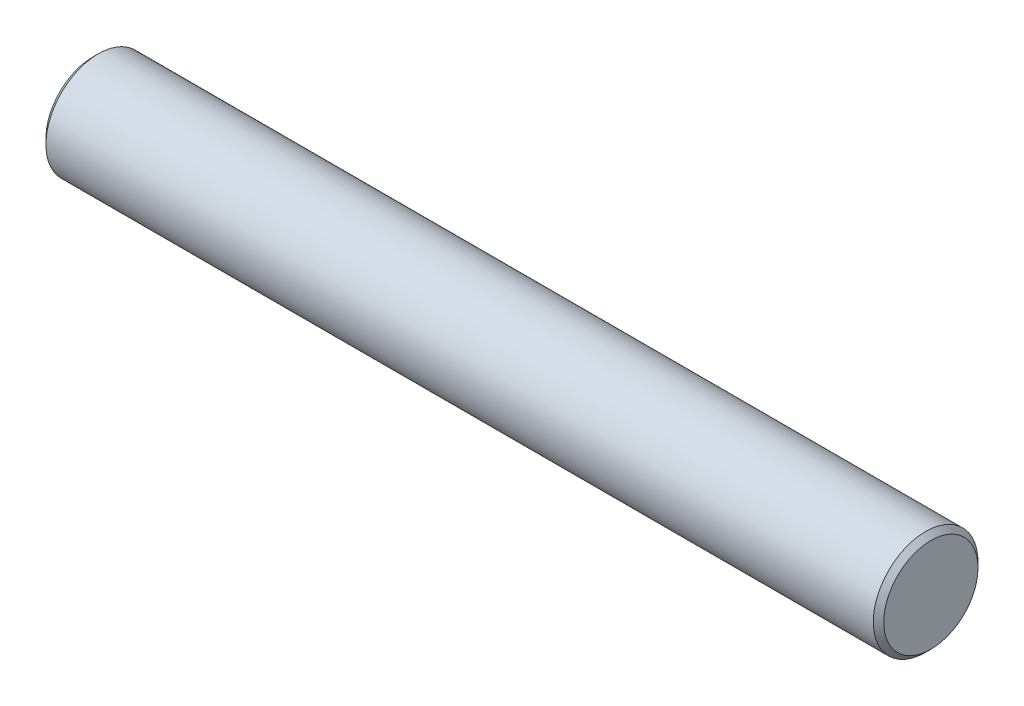
ISO-10303-21;
HEADER;
FILE_DESCRIPTION(('STEP AP214'),'2;1');
FILE_NAME('part.step','',(''),(''),'','','');
FILE_SCHEMA(('AUTOMOTIVE_DESIGN { 1 0 10303 214 1 1 1 1 }'));
ENDSEC;
DATA;
#1=APPLICATION_CONTEXT('core data for automotive mechanical design processes');
#2=APPLICATION_PROTOCOL_DEFINITION('international standard','automotive_design',2000,#1);
#3=PRODUCT_CONTEXT('',#1,'mechanical');
#4=PRODUCT('Part','Part','',(#3));
#5=PRODUCT_RELATED_PRODUCT_CATEGORY('part','',(#4));
#6=PRODUCT_DEFINITION_FORMATION('','',#4);
#7=PRODUCT_DEFINITION_CONTEXT('part definition',#1,'design');
#8=PRODUCT_DEFINITION('design','',#6,#7);
#9=PRODUCT_DEFINITION_SHAPE('','',#8);
#10=(LENGTH_UNIT() NAMED_UNIT(*) SI_UNIT(.MILLI.,.METRE.));
#11=(NAMED_UNIT(*) PLANE_ANGLE_UNIT() SI_UNIT($,.RADIAN.));
#12=(NAMED_UNIT(*) SI_UNIT($,.STERADIAN.) SOLID_ANGLE_UNIT());
#13=UNCERTAINTY_MEASURE_WITH_UNIT(LENGTH_MEASURE(1.E-05),#10,'distance_accuracy_value','');
#14=(GEOMETRIC_REPRESENTATION_CONTEXT(3) GLOBAL_UNCERTAINTY_ASSIGNED_CONTEXT((#13)) GLOBAL_UNIT_ASSIGNED_CONTEXT((#10,
#11,#12)) REPRESENTATION_CONTEXT('',''));
#15=CARTESIAN_POINT('',(0.,0.,0.));
#16=DIRECTION('',(0.,0.,1.));
#17=DIRECTION('',(1.,0.,0.));
#18=AXIS2_PLACEMENT_3D('',#15,#16,#17);
#19=CARTESIAN_POINT('',(20.,0.,0.));
#20=DIRECTION('',(-1.,0.,0.));
#21=DIRECTION('',(0.,0.,1.));
#22=AXIS2_PLACEMENT_3D('',#19,#20,#21);
#23=CYLINDRICAL_SURFACE('',#22,2.5);
#24=CARTESIAN_POINT('',(-19.75,0.,0.));
#25=DIRECTION('',(1.,0.,0.));
#26=DIRECTION('',(0.,0.,-1.));
#27=AXIS2_PLACEMENT_3D('',#24,#25,#26);
#28=CIRCLE('',#27,2.5);
#29=CARTESIAN_POINT('',(-19.75,0.,-2.5));
#30=VERTEX_POINT('',#29);
#31=EDGE_CURVE('E48',#30,#30,#28,.T.);
#32=ORIENTED_EDGE('',*,*,#31,.T.);
#33=EDGE_LOOP('',(#32));
#34=FACE_BOUND('',#33,.T.);
#35=CARTESIAN_POINT('',(19.75,0.,0.));
#36=DIRECTION('',(1.,0.,0.));
#37=DIRECTION('',(0.,0.,-1.));
#38=AXIS2_PLACEMENT_3D('',#35,#36,#37);
#39=CIRCLE('',#38,2.5);
#40=CARTESIAN_POINT('',(19.75,0.,-2.5));
#41=VERTEX_POINT('',#40);
#42=EDGE_CURVE('E52',#41,#41,#39,.F.);
#43=ORIENTED_EDGE('',*,*,#42,.T.);
#44=EDGE_LOOP('',(#43));
#45=FACE_BOUND('',#44,.T.);
#46=ADVANCED_FACE('F36',(#34,#45),#23,.T.);
#47=CARTESIAN_POINT('',(20.,0.,0.));
#48=DIRECTION('',(1.,0.,0.));
#49=DIRECTION('',(0.,0.,-1.));
#50=AXIS2_PLACEMENT_3D('',#47,#48,#49);
#51=PLANE('',#50);
#52=CARTESIAN_POINT('',(20.,0.,0.));
#53=DIRECTION('',(1.,0.,0.));
#54=DIRECTION('',(0.,0.,-1.));
#55=AXIS2_PLACEMENT_3D('',#52,#53,#54);
#56=CIRCLE('',#55,2.25);
#57=CARTESIAN_POINT('',(20.,0.,-2.25));
#58=VERTEX_POINT('',#57);
#59=EDGE_CURVE('E10',#58,#58,#56,.T.);
#60=ORIENTED_EDGE('',*,*,#59,.T.);
#61=EDGE_LOOP('',(#60));
#62=FACE_BOUND('',#61,.T.);
#63=ADVANCED_FACE('F68',(#62),#51,.T.);
#64=CARTESIAN_POINT('',(-20.,0.,0.));
#65=DIRECTION('',(1.,0.,0.));
#66=DIRECTION('',(0.,0.,-1.));
#67=AXIS2_PLACEMENT_3D('',#64,#65,#66);
#68=PLANE('',#67);
#69=CARTESIAN_POINT('',(-20.,0.,0.));
#70=DIRECTION('',(1.,0.,0.));
#71=DIRECTION('',(0.,0.,-1.));
#72=AXIS2_PLACEMENT_3D('',#69,#70,#71);
#73=CIRCLE('',#72,2.25000000000001);
#74=CARTESIAN_POINT('',(-20.,0.,-2.25000000000001));
#75=VERTEX_POINT('',#74);
#76=EDGE_CURVE('E44',#75,#75,#73,.F.);
#77=ORIENTED_EDGE('',*,*,#76,.T.);
#78=EDGE_LOOP('',(#77));
#79=FACE_BOUND('',#78,.T.);
#80=ADVANCED_FACE('F65',(#79),#68,.F.);
#81=CARTESIAN_POINT('',(-19.75,0.,0.));
#82=DIRECTION('',(1.,0.,0.));
#83=DIRECTION('',(0.,0.,-1.));
#84=AXIS2_PLACEMENT_3D('',#81,#82,#83);
#85=CONICAL_SURFACE('',#84,2.5,0.78539816339745);
#86=ORIENTED_EDGE('',*,*,#76,.F.);
#87=EDGE_LOOP('',(#86));
#88=FACE_BOUND('',#87,.T.);
#89=ORIENTED_EDGE('',*,*,#31,.F.);
#90=EDGE_LOOP('',(#89));
#91=FACE_BOUND('',#90,.T.);
#92=ADVANCED_FACE('F61',(#88,#91),#85,.T.);
#93=CARTESIAN_POINT('',(20.,0.,0.));
#94=DIRECTION('',(-1.,0.,0.));
#95=DIRECTION('',(0.,0.,1.));
#96=AXIS2_PLACEMENT_3D('',#93,#94,#95);
#97=CONICAL_SURFACE('',#96,2.25,0.785398163397443);
#98=ORIENTED_EDGE('',*,*,#42,.F.);
#99=EDGE_LOOP('',(#98));
#100=FACE_BOUND('',#99,.T.);
#101=ORIENTED_EDGE('',*,*,#59,.F.);
#102=EDGE_LOOP('',(#101));
#103=FACE_BOUND('',#102,.T.);
#104=ADVANCED_FACE('F39',(#100,#103),#97,.T.);
#105=CLOSED_SHELL('',(#46,#63,#80,#92,#104));
#106=MANIFOLD_SOLID_BREP('B2',#105);
#107=ADVANCED_BREP_SHAPE_REPRESENTATION('',(#18,#106),#14);
#108=SHAPE_DEFINITION_REPRESENTATION(#9,#107);
ENDSEC;
END-ISO-10303-21;
